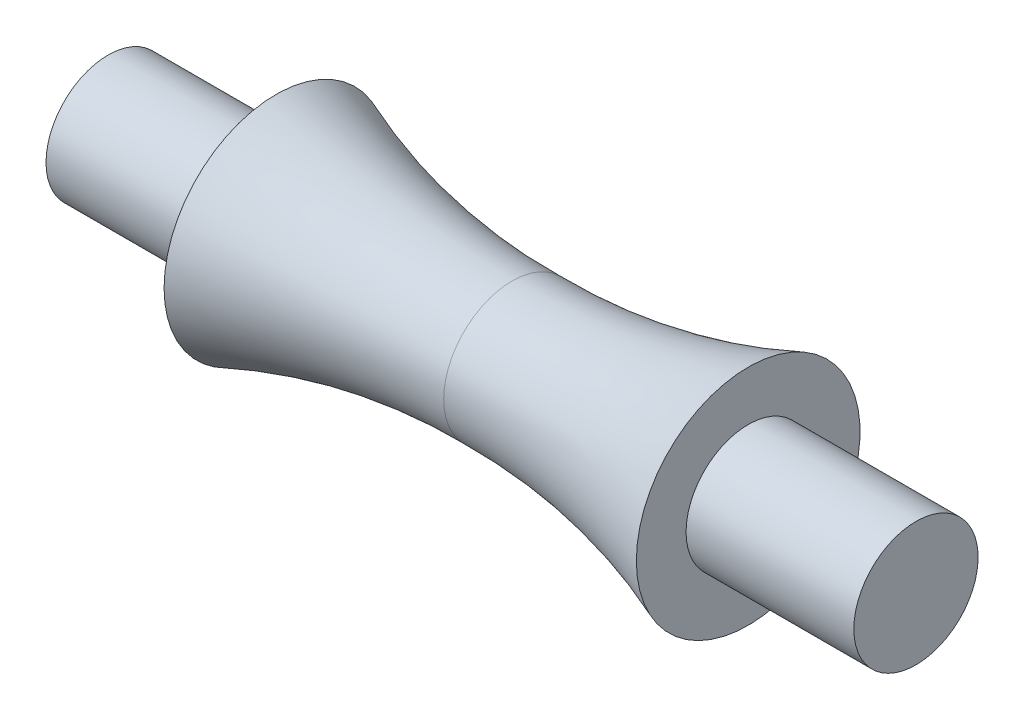
ISO-10303-21;
HEADER;
FILE_DESCRIPTION(('STEP AP214'),'2;1');
FILE_NAME('part.step','',(''),(''),'','','');
FILE_SCHEMA(('AUTOMOTIVE_DESIGN { 1 0 10303 214 1 1 1 1 }'));
ENDSEC;
DATA;
#1=APPLICATION_CONTEXT('core data for automotive mechanical design processes');
#2=APPLICATION_PROTOCOL_DEFINITION('international standard','automotive_design',2000,#1);
#3=PRODUCT_CONTEXT('',#1,'mechanical');
#4=PRODUCT('Part','Part','',(#3));
#5=PRODUCT_RELATED_PRODUCT_CATEGORY('part','',(#4));
#6=PRODUCT_DEFINITION_FORMATION('','',#4);
#7=PRODUCT_DEFINITION_CONTEXT('part definition',#1,'design');
#8=PRODUCT_DEFINITION('design','',#6,#7);
#9=PRODUCT_DEFINITION_SHAPE('','',#8);
#10=(LENGTH_UNIT() NAMED_UNIT(*) SI_UNIT(.MILLI.,.METRE.));
#11=(NAMED_UNIT(*) PLANE_ANGLE_UNIT() SI_UNIT($,.RADIAN.));
#12=(NAMED_UNIT(*) SI_UNIT($,.STERADIAN.) SOLID_ANGLE_UNIT());
#13=UNCERTAINTY_MEASURE_WITH_UNIT(LENGTH_MEASURE(1.E-05),#10,'distance_accuracy_value','');
#14=(GEOMETRIC_REPRESENTATION_CONTEXT(3) GLOBAL_UNCERTAINTY_ASSIGNED_CONTEXT((#13)) GLOBAL_UNIT_ASSIGNED_CONTEXT((#10,
#11,#12)) REPRESENTATION_CONTEXT('',''));
#15=CARTESIAN_POINT('',(0.,0.,0.));
#16=DIRECTION('',(0.,0.,1.));
#17=DIRECTION('',(1.,0.,0.));
#18=AXIS2_PLACEMENT_3D('',#15,#16,#17);
#19=CARTESIAN_POINT('',(8.255,0.,0.));
#20=DIRECTION('',(-1.,0.,0.));
#21=DIRECTION('',(0.,0.,1.));
#22=AXIS2_PLACEMENT_3D('',#19,#20,#21);
#23=PLANE('',#22);
#24=CARTESIAN_POINT('',(8.255,0.,0.));
#25=DIRECTION('',(-1.,0.,0.));
#26=DIRECTION('',(0.,0.,1.));
#27=AXIS2_PLACEMENT_3D('',#24,#25,#26);
#28=CIRCLE('',#27,1.27);
#29=CARTESIAN_POINT('',(8.255,0.,1.27));
#30=VERTEX_POINT('',#29);
#31=EDGE_CURVE('E12',#30,#30,#28,.T.);
#32=ORIENTED_EDGE('',*,*,#31,.F.);
#33=EDGE_LOOP('',(#32));
#34=FACE_BOUND('',#33,.T.);
#35=ADVANCED_FACE('F51',(#34),#23,.F.);
#36=CARTESIAN_POINT('',(0.,0.,0.));
#37=DIRECTION('',(-1.,0.,0.));
#38=DIRECTION('',(0.,0.,1.));
#39=AXIS2_PLACEMENT_3D('',#36,#37,#38);
#40=CYLINDRICAL_SURFACE('',#39,1.27);
#41=CARTESIAN_POINT('',(4.826,0.,0.));
#42=DIRECTION('',(-1.,0.,0.));
#43=DIRECTION('',(0.,0.,1.));
#44=AXIS2_PLACEMENT_3D('',#41,#42,#43);
#45=CIRCLE('',#44,1.27);
#46=CARTESIAN_POINT('',(4.826,0.,1.27));
#47=VERTEX_POINT('',#46);
#48=EDGE_CURVE('E58',#47,#47,#45,.T.);
#49=ORIENTED_EDGE('',*,*,#48,.F.);
#50=EDGE_LOOP('',(#49));
#51=FACE_BOUND('',#50,.T.);
#52=ORIENTED_EDGE('',*,*,#31,.T.);
#53=EDGE_LOOP('',(#52));
#54=FACE_BOUND('',#53,.T.);
#55=ADVANCED_FACE('F103',(#51,#54),#40,.T.);
#56=CARTESIAN_POINT('',(4.826,0.,-1.27));
#57=DIRECTION('',(-1.,0.,0.));
#58=DIRECTION('',(0.,0.,1.));
#59=AXIS2_PLACEMENT_3D('',#56,#57,#58);
#60=PLANE('',#59);
#61=CARTESIAN_POINT('',(4.826,0.,0.));
#62=DIRECTION('',(-1.,0.,0.));
#63=DIRECTION('',(0.,0.,1.));
#64=AXIS2_PLACEMENT_3D('',#61,#62,#63);
#65=CIRCLE('',#64,2.286);
#66=CARTESIAN_POINT('',(4.826,0.,2.286));
#67=VERTEX_POINT('',#66);
#68=EDGE_CURVE('E64',#67,#67,#65,.T.);
#69=ORIENTED_EDGE('',*,*,#68,.F.);
#70=EDGE_LOOP('',(#69));
#71=FACE_BOUND('',#70,.T.);
#72=ORIENTED_EDGE('',*,*,#48,.T.);
#73=EDGE_LOOP('',(#72));
#74=FACE_BOUND('',#73,.T.);
#75=ADVANCED_FACE('F108',(#71,#74),#60,.F.);
#76=CARTESIAN_POINT('',(0.155583454036609,0.,0.));
#77=DIRECTION('',(-1.,0.,0.));
#78=DIRECTION('',(0.,0.,1.));
#79=AXIS2_PLACEMENT_3D('',#76,#77,#78);
#80=TOROIDAL_SURFACE('',#79,14.0960469638013,12.7);
#81=CARTESIAN_POINT('',(0.,0.,0.));
#82=DIRECTION('',(-1.,0.,0.));
#83=DIRECTION('',(0.,0.,1.));
#84=AXIS2_PLACEMENT_3D('',#81,#82,#83);
#85=CIRCLE('',#84,1.397);
#86=CARTESIAN_POINT('',(0.,0.,1.397));
#87=VERTEX_POINT('',#86);
#88=EDGE_CURVE('E70',#87,#87,#85,.T.);
#89=ORIENTED_EDGE('',*,*,#88,.F.);
#90=EDGE_LOOP('',(#89));
#91=FACE_BOUND('',#90,.T.);
#92=ORIENTED_EDGE('',*,*,#68,.T.);
#93=EDGE_LOOP('',(#92));
#94=FACE_BOUND('',#93,.T.);
#95=ADVANCED_FACE('F113',(#91,#94),#80,.F.);
#96=CARTESIAN_POINT('',(-8.255,0.,0.));
#97=DIRECTION('',(1.,0.,0.));
#98=DIRECTION('',(0.,0.,1.));
#99=AXIS2_PLACEMENT_3D('',#96,#97,#98);
#100=PLANE('',#99);
#101=CARTESIAN_POINT('',(-8.255,0.,0.));
#102=DIRECTION('',(-1.,0.,0.));
#103=DIRECTION('',(0.,0.,1.));
#104=AXIS2_PLACEMENT_3D('',#101,#102,#103);
#105=CIRCLE('',#104,1.27);
#106=CARTESIAN_POINT('',(-8.255,0.,1.27));
#107=VERTEX_POINT('',#106);
#108=EDGE_CURVE('E76',#107,#107,#105,.T.);
#109=ORIENTED_EDGE('',*,*,#108,.T.);
#110=EDGE_LOOP('',(#109));
#111=FACE_BOUND('',#110,.T.);
#112=ADVANCED_FACE('F119',(#111),#100,.F.);
#113=CARTESIAN_POINT('',(0.,0.,0.));
#114=DIRECTION('',(1.,0.,0.));
#115=DIRECTION('',(0.,0.,1.));
#116=AXIS2_PLACEMENT_3D('',#113,#114,#115);
#117=CYLINDRICAL_SURFACE('',#116,1.27);
#118=CARTESIAN_POINT('',(-4.826,0.,0.));
#119=DIRECTION('',(-1.,0.,0.));
#120=DIRECTION('',(0.,0.,1.));
#121=AXIS2_PLACEMENT_3D('',#118,#119,#120);
#122=CIRCLE('',#121,1.27);
#123=CARTESIAN_POINT('',(-4.826,0.,1.27));
#124=VERTEX_POINT('',#123);
#125=EDGE_CURVE('E80',#124,#124,#122,.T.);
#126=ORIENTED_EDGE('',*,*,#125,.T.);
#127=EDGE_LOOP('',(#126));
#128=FACE_BOUND('',#127,.T.);
#129=ORIENTED_EDGE('',*,*,#108,.F.);
#130=EDGE_LOOP('',(#129));
#131=FACE_BOUND('',#130,.T.);
#132=ADVANCED_FACE('F100',(#128,#131),#117,.T.);
#133=CARTESIAN_POINT('',(-4.826,0.,-1.27));
#134=DIRECTION('',(1.,0.,0.));
#135=DIRECTION('',(0.,0.,1.));
#136=AXIS2_PLACEMENT_3D('',#133,#134,#135);
#137=PLANE('',#136);
#138=CARTESIAN_POINT('',(-4.826,0.,0.));
#139=DIRECTION('',(-1.,0.,0.));
#140=DIRECTION('',(0.,0.,1.));
#141=AXIS2_PLACEMENT_3D('',#138,#139,#140);
#142=CIRCLE('',#141,2.286);
#143=CARTESIAN_POINT('',(-4.826,0.,2.286));
#144=VERTEX_POINT('',#143);
#145=EDGE_CURVE('E84',#144,#144,#142,.T.);
#146=ORIENTED_EDGE('',*,*,#145,.T.);
#147=EDGE_LOOP('',(#146));
#148=FACE_BOUND('',#147,.T.);
#149=ORIENTED_EDGE('',*,*,#125,.F.);
#150=EDGE_LOOP('',(#149));
#151=FACE_BOUND('',#150,.T.);
#152=ADVANCED_FACE('F90',(#148,#151),#137,.F.);
#153=CARTESIAN_POINT('',(-0.155583454036609,0.,0.));
#154=DIRECTION('',(1.,0.,0.));
#155=DIRECTION('',(0.,0.,1.));
#156=AXIS2_PLACEMENT_3D('',#153,#154,#155);
#157=TOROIDAL_SURFACE('',#156,14.0960469638013,12.7);
#158=ORIENTED_EDGE('',*,*,#88,.T.);
#159=EDGE_LOOP('',(#158));
#160=FACE_BOUND('',#159,.T.);
#161=ORIENTED_EDGE('',*,*,#145,.F.);
#162=EDGE_LOOP('',(#161));
#163=FACE_BOUND('',#162,.T.);
#164=ADVANCED_FACE('F93',(#160,#163),#157,.F.);
#165=CLOSED_SHELL('',(#35,#55,#75,#95,#112,#132,#152,#164));
#166=MANIFOLD_SOLID_BREP('B2',#165);
#167=ADVANCED_BREP_SHAPE_REPRESENTATION('',(#18,#166),#14);
#168=SHAPE_DEFINITION_REPRESENTATION(#9,#167);
ENDSEC;
END-ISO-10303-21;
